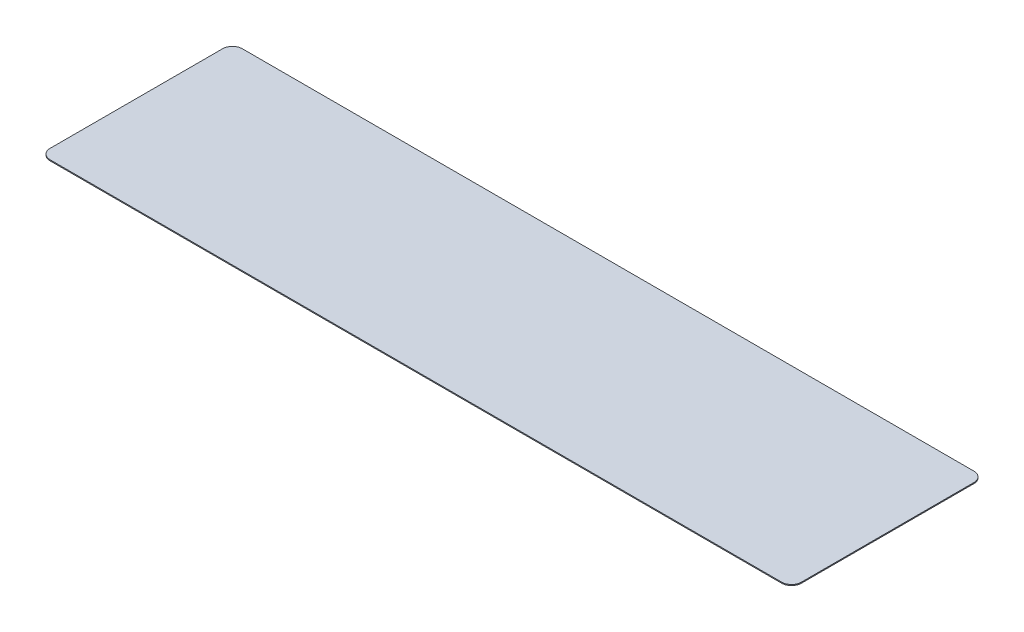
ISO-10303-21;
HEADER;
FILE_DESCRIPTION(('STEP AP214'),'2;1');
FILE_NAME('part.step','',(''),(''),'','','');
FILE_SCHEMA(('AUTOMOTIVE_DESIGN { 1 0 10303 214 1 1 1 1 }'));
ENDSEC;
DATA;
#1=APPLICATION_CONTEXT('core data for automotive mechanical design processes');
#2=APPLICATION_PROTOCOL_DEFINITION('international standard','automotive_design',2000,#1);
#3=PRODUCT_CONTEXT('',#1,'mechanical');
#4=PRODUCT('Part','Part','',(#3));
#5=PRODUCT_RELATED_PRODUCT_CATEGORY('part','',(#4));
#6=PRODUCT_DEFINITION_FORMATION('','',#4);
#7=PRODUCT_DEFINITION_CONTEXT('part definition',#1,'design');
#8=PRODUCT_DEFINITION('design','',#6,#7);
#9=PRODUCT_DEFINITION_SHAPE('','',#8);
#10=(LENGTH_UNIT() NAMED_UNIT(*) SI_UNIT(.MILLI.,.METRE.));
#11=(NAMED_UNIT(*) PLANE_ANGLE_UNIT() SI_UNIT($,.RADIAN.));
#12=(NAMED_UNIT(*) SI_UNIT($,.STERADIAN.) SOLID_ANGLE_UNIT());
#13=UNCERTAINTY_MEASURE_WITH_UNIT(LENGTH_MEASURE(1.E-05),#10,'distance_accuracy_value','');
#14=(GEOMETRIC_REPRESENTATION_CONTEXT(3) GLOBAL_UNCERTAINTY_ASSIGNED_CONTEXT((#13)) GLOBAL_UNIT_ASSIGNED_CONTEXT((#10,
#11,#12)) REPRESENTATION_CONTEXT('',''));
#15=CARTESIAN_POINT('',(0.,0.,0.));
#16=DIRECTION('',(0.,0.,1.));
#17=DIRECTION('',(1.,0.,0.));
#18=AXIS2_PLACEMENT_3D('',#15,#16,#17);
#19=CARTESIAN_POINT('',(74.2,0.2,17.5));
#20=DIRECTION('',(0.,-1.,0.));
#21=DIRECTION('',(0.,0.,-1.));
#22=AXIS2_PLACEMENT_3D('',#19,#20,#21);
#23=CYLINDRICAL_SURFACE('',#22,2.);
#24=CARTESIAN_POINT('',(74.2,0.,17.5));
#25=DIRECTION('',(0.,1.,0.));
#26=DIRECTION('',(0.,0.,1.));
#27=AXIS2_PLACEMENT_3D('',#24,#25,#26);
#28=CIRCLE('',#27,2.);
#29=CARTESIAN_POINT('',(74.2,0.,19.5));
#30=VERTEX_POINT('',#29);
#31=CARTESIAN_POINT('',(76.2,0.,17.5));
#32=VERTEX_POINT('',#31);
#33=EDGE_CURVE('E131',#30,#32,#28,.T.);
#34=ORIENTED_EDGE('',*,*,#33,.T.);
#35=DIRECTION('',(0.,-1.,0.));
#36=VECTOR('',#35,1.);
#37=CARTESIAN_POINT('',(76.2,0.2,17.5));
#38=LINE('',#37,#36);
#39=CARTESIAN_POINT('',(76.2,0.2,17.5));
#40=VERTEX_POINT('',#39);
#41=EDGE_CURVE('E11',#40,#32,#38,.T.);
#42=ORIENTED_EDGE('',*,*,#41,.F.);
#43=CARTESIAN_POINT('',(74.2,0.2,17.5));
#44=DIRECTION('',(0.,1.,0.));
#45=DIRECTION('',(0.,0.,1.));
#46=AXIS2_PLACEMENT_3D('',#43,#44,#45);
#47=CIRCLE('',#46,2.);
#48=CARTESIAN_POINT('',(74.2,0.2,19.5));
#49=VERTEX_POINT('',#48);
#50=EDGE_CURVE('E145',#49,#40,#47,.T.);
#51=ORIENTED_EDGE('',*,*,#50,.F.);
#52=DIRECTION('',(0.,-1.,0.));
#53=VECTOR('',#52,1.);
#54=CARTESIAN_POINT('',(74.2,0.2,19.5));
#55=LINE('',#54,#53);
#56=EDGE_CURVE('E127',#49,#30,#55,.T.);
#57=ORIENTED_EDGE('',*,*,#56,.T.);
#58=EDGE_LOOP('',(#34,#42,#51,#57));
#59=FACE_BOUND('',#58,.T.);
#60=ADVANCED_FACE('F35',(#59),#23,.T.);
#61=CARTESIAN_POINT('',(76.2,0.2,17.5));
#62=DIRECTION('',(-1.,0.,0.));
#63=DIRECTION('',(0.,0.,1.));
#64=AXIS2_PLACEMENT_3D('',#61,#62,#63);
#65=PLANE('',#64);
#66=DIRECTION('',(0.,0.,-1.));
#67=VECTOR('',#66,1.);
#68=CARTESIAN_POINT('',(76.2,0.,17.5));
#69=LINE('',#68,#67);
#70=CARTESIAN_POINT('',(76.2,0.,-17.5));
#71=VERTEX_POINT('',#70);
#72=EDGE_CURVE('E134',#32,#71,#69,.T.);
#73=ORIENTED_EDGE('',*,*,#72,.T.);
#74=DIRECTION('',(0.,-1.,0.));
#75=VECTOR('',#74,1.);
#76=CARTESIAN_POINT('',(76.2,0.2,-17.5));
#77=LINE('',#76,#75);
#78=CARTESIAN_POINT('',(76.2,0.2,-17.5));
#79=VERTEX_POINT('',#78);
#80=EDGE_CURVE('E43',#79,#71,#77,.T.);
#81=ORIENTED_EDGE('',*,*,#80,.F.);
#82=DIRECTION('',(0.,0.,-1.));
#83=VECTOR('',#82,1.);
#84=CARTESIAN_POINT('',(76.2,0.2,17.5));
#85=LINE('',#84,#83);
#86=EDGE_CURVE('E94',#40,#79,#85,.T.);
#87=ORIENTED_EDGE('',*,*,#86,.F.);
#88=ORIENTED_EDGE('',*,*,#41,.T.);
#89=EDGE_LOOP('',(#73,#81,#87,#88));
#90=FACE_BOUND('',#89,.T.);
#91=ADVANCED_FACE('F180',(#90),#65,.F.);
#92=CARTESIAN_POINT('',(74.2,0.2,-17.5));
#93=DIRECTION('',(0.,-1.,0.));
#94=DIRECTION('',(0.,0.,-1.));
#95=AXIS2_PLACEMENT_3D('',#92,#93,#94);
#96=CYLINDRICAL_SURFACE('',#95,2.);
#97=CARTESIAN_POINT('',(74.2,0.,-17.5));
#98=DIRECTION('',(0.,1.,0.));
#99=DIRECTION('',(0.,0.,1.));
#100=AXIS2_PLACEMENT_3D('',#97,#98,#99);
#101=CIRCLE('',#100,2.);
#102=CARTESIAN_POINT('',(74.2,0.,-19.5));
#103=VERTEX_POINT('',#102);
#104=EDGE_CURVE('E136',#71,#103,#101,.T.);
#105=ORIENTED_EDGE('',*,*,#104,.T.);
#106=DIRECTION('',(0.,-1.,0.));
#107=VECTOR('',#106,1.);
#108=CARTESIAN_POINT('',(74.2,0.2,-19.5));
#109=LINE('',#108,#107);
#110=CARTESIAN_POINT('',(74.2,0.2,-19.5));
#111=VERTEX_POINT('',#110);
#112=EDGE_CURVE('E152',#111,#103,#109,.T.);
#113=ORIENTED_EDGE('',*,*,#112,.F.);
#114=CARTESIAN_POINT('',(74.2,0.2,-17.5));
#115=DIRECTION('',(0.,1.,0.));
#116=DIRECTION('',(0.,0.,1.));
#117=AXIS2_PLACEMENT_3D('',#114,#115,#116);
#118=CIRCLE('',#117,2.);
#119=EDGE_CURVE('E160',#79,#111,#118,.T.);
#120=ORIENTED_EDGE('',*,*,#119,.F.);
#121=ORIENTED_EDGE('',*,*,#80,.T.);
#122=EDGE_LOOP('',(#105,#113,#120,#121));
#123=FACE_BOUND('',#122,.T.);
#124=ADVANCED_FACE('F158',(#123),#96,.T.);
#125=CARTESIAN_POINT('',(74.2,0.2,-19.5));
#126=DIRECTION('',(0.,0.,1.));
#127=DIRECTION('',(1.,0.,0.));
#128=AXIS2_PLACEMENT_3D('',#125,#126,#127);
#129=PLANE('',#128);
#130=DIRECTION('',(-1.,0.,0.));
#131=VECTOR('',#130,1.);
#132=CARTESIAN_POINT('',(74.2,0.,-19.5));
#133=LINE('',#132,#131);
#134=CARTESIAN_POINT('',(-74.2,0.,-19.5));
#135=VERTEX_POINT('',#134);
#136=EDGE_CURVE('E138',#103,#135,#133,.T.);
#137=ORIENTED_EDGE('',*,*,#136,.T.);
#138=DIRECTION('',(0.,-1.,0.));
#139=VECTOR('',#138,1.);
#140=CARTESIAN_POINT('',(-74.2,0.2,-19.5));
#141=LINE('',#140,#139);
#142=CARTESIAN_POINT('',(-74.2,0.2,-19.5));
#143=VERTEX_POINT('',#142);
#144=EDGE_CURVE('E149',#143,#135,#141,.T.);
#145=ORIENTED_EDGE('',*,*,#144,.F.);
#146=DIRECTION('',(-1.,0.,0.));
#147=VECTOR('',#146,1.);
#148=CARTESIAN_POINT('',(74.2,0.2,-19.5));
#149=LINE('',#148,#147);
#150=EDGE_CURVE('E172',#111,#143,#149,.T.);
#151=ORIENTED_EDGE('',*,*,#150,.F.);
#152=ORIENTED_EDGE('',*,*,#112,.T.);
#153=EDGE_LOOP('',(#137,#145,#151,#152));
#154=FACE_BOUND('',#153,.T.);
#155=ADVANCED_FACE('F168',(#154),#129,.F.);
#156=CARTESIAN_POINT('',(-74.2,0.2,-17.5));
#157=DIRECTION('',(0.,-1.,0.));
#158=DIRECTION('',(0.,0.,-1.));
#159=AXIS2_PLACEMENT_3D('',#156,#157,#158);
#160=CYLINDRICAL_SURFACE('',#159,2.);
#161=CARTESIAN_POINT('',(-74.2,0.,-17.5));
#162=DIRECTION('',(0.,1.,0.));
#163=DIRECTION('',(0.,0.,1.));
#164=AXIS2_PLACEMENT_3D('',#161,#162,#163);
#165=CIRCLE('',#164,2.);
#166=CARTESIAN_POINT('',(-76.2,0.,-17.5));
#167=VERTEX_POINT('',#166);
#168=EDGE_CURVE('E140',#135,#167,#165,.T.);
#169=ORIENTED_EDGE('',*,*,#168,.T.);
#170=DIRECTION('',(0.,-1.,0.));
#171=VECTOR('',#170,1.);
#172=CARTESIAN_POINT('',(-76.2,0.2,-17.5));
#173=LINE('',#172,#171);
#174=CARTESIAN_POINT('',(-76.2,0.2,-17.5));
#175=VERTEX_POINT('',#174);
#176=EDGE_CURVE('E122',#175,#167,#173,.T.);
#177=ORIENTED_EDGE('',*,*,#176,.F.);
#178=CARTESIAN_POINT('',(-74.2,0.2,-17.5));
#179=DIRECTION('',(0.,1.,0.));
#180=DIRECTION('',(0.,0.,1.));
#181=AXIS2_PLACEMENT_3D('',#178,#179,#180);
#182=CIRCLE('',#181,2.);
#183=EDGE_CURVE('E113',#143,#175,#182,.T.);
#184=ORIENTED_EDGE('',*,*,#183,.F.);
#185=ORIENTED_EDGE('',*,*,#144,.T.);
#186=EDGE_LOOP('',(#169,#177,#184,#185));
#187=FACE_BOUND('',#186,.T.);
#188=ADVANCED_FACE('F171',(#187),#160,.T.);
#189=CARTESIAN_POINT('',(-76.2,0.2,17.5));
#190=DIRECTION('',(1.,0.,0.));
#191=DIRECTION('',(0.,0.,-1.));
#192=AXIS2_PLACEMENT_3D('',#189,#190,#191);
#193=PLANE('',#192);
#194=DIRECTION('',(0.,0.,1.));
#195=VECTOR('',#194,1.);
#196=CARTESIAN_POINT('',(-76.2,0.,17.5));
#197=LINE('',#196,#195);
#198=CARTESIAN_POINT('',(-76.2,0.,17.5));
#199=VERTEX_POINT('',#198);
#200=EDGE_CURVE('E121',#167,#199,#197,.T.);
#201=ORIENTED_EDGE('',*,*,#200,.T.);
#202=DIRECTION('',(0.,-1.,0.));
#203=VECTOR('',#202,1.);
#204=CARTESIAN_POINT('',(-76.2,0.2,17.5));
#205=LINE('',#204,#203);
#206=CARTESIAN_POINT('',(-76.2,0.2,17.5));
#207=VERTEX_POINT('',#206);
#208=EDGE_CURVE('E118',#207,#199,#205,.T.);
#209=ORIENTED_EDGE('',*,*,#208,.F.);
#210=DIRECTION('',(0.,0.,1.));
#211=VECTOR('',#210,1.);
#212=CARTESIAN_POINT('',(-76.2,0.2,17.5));
#213=LINE('',#212,#211);
#214=EDGE_CURVE('E107',#175,#207,#213,.T.);
#215=ORIENTED_EDGE('',*,*,#214,.F.);
#216=ORIENTED_EDGE('',*,*,#176,.T.);
#217=EDGE_LOOP('',(#201,#209,#215,#216));
#218=FACE_BOUND('',#217,.T.);
#219=ADVANCED_FACE('F119',(#218),#193,.F.);
#220=CARTESIAN_POINT('',(-74.2,0.2,17.5));
#221=DIRECTION('',(0.,-1.,0.));
#222=DIRECTION('',(0.,0.,-1.));
#223=AXIS2_PLACEMENT_3D('',#220,#221,#222);
#224=CYLINDRICAL_SURFACE('',#223,2.);
#225=CARTESIAN_POINT('',(-74.2,0.,17.5));
#226=DIRECTION('',(0.,1.,0.));
#227=DIRECTION('',(0.,0.,-1.));
#228=AXIS2_PLACEMENT_3D('',#225,#226,#227);
#229=CIRCLE('',#228,2.);
#230=CARTESIAN_POINT('',(-74.2,0.,19.5));
#231=VERTEX_POINT('',#230);
#232=EDGE_CURVE('E80',#199,#231,#229,.T.);
#233=ORIENTED_EDGE('',*,*,#232,.T.);
#234=DIRECTION('',(0.,-1.,0.));
#235=VECTOR('',#234,1.);
#236=CARTESIAN_POINT('',(-74.2,0.2,19.5));
#237=LINE('',#236,#235);
#238=CARTESIAN_POINT('',(-74.2,0.2,19.5));
#239=VERTEX_POINT('',#238);
#240=EDGE_CURVE('E123',#239,#231,#237,.T.);
#241=ORIENTED_EDGE('',*,*,#240,.F.);
#242=CARTESIAN_POINT('',(-74.2,0.2,17.5));
#243=DIRECTION('',(0.,1.,0.));
#244=DIRECTION('',(0.,0.,-1.));
#245=AXIS2_PLACEMENT_3D('',#242,#243,#244);
#246=CIRCLE('',#245,2.);
#247=EDGE_CURVE('E111',#207,#239,#246,.T.);
#248=ORIENTED_EDGE('',*,*,#247,.F.);
#249=ORIENTED_EDGE('',*,*,#208,.T.);
#250=EDGE_LOOP('',(#233,#241,#248,#249));
#251=FACE_BOUND('',#250,.T.);
#252=ADVANCED_FACE('F125',(#251),#224,.T.);
#253=CARTESIAN_POINT('',(74.2,0.2,19.5));
#254=DIRECTION('',(0.,0.,-1.));
#255=DIRECTION('',(-1.,0.,0.));
#256=AXIS2_PLACEMENT_3D('',#253,#254,#255);
#257=PLANE('',#256);
#258=DIRECTION('',(1.,0.,0.));
#259=VECTOR('',#258,1.);
#260=CARTESIAN_POINT('',(74.2,0.,19.5));
#261=LINE('',#260,#259);
#262=EDGE_CURVE('E86',#231,#30,#261,.T.);
#263=ORIENTED_EDGE('',*,*,#262,.T.);
#264=ORIENTED_EDGE('',*,*,#56,.F.);
#265=DIRECTION('',(1.,0.,0.));
#266=VECTOR('',#265,1.);
#267=CARTESIAN_POINT('',(74.2,0.2,19.5));
#268=LINE('',#267,#266);
#269=EDGE_CURVE('E51',#239,#49,#268,.T.);
#270=ORIENTED_EDGE('',*,*,#269,.F.);
#271=ORIENTED_EDGE('',*,*,#240,.T.);
#272=EDGE_LOOP('',(#263,#264,#270,#271));
#273=FACE_BOUND('',#272,.T.);
#274=ADVANCED_FACE('F196',(#273),#257,.F.);
#275=CARTESIAN_POINT('',(74.2,0.2,17.5));
#276=DIRECTION('',(0.,1.,0.));
#277=DIRECTION('',(0.,0.,1.));
#278=AXIS2_PLACEMENT_3D('',#275,#276,#277);
#279=PLANE('',#278);
#280=ORIENTED_EDGE('',*,*,#50,.T.);
#281=ORIENTED_EDGE('',*,*,#86,.T.);
#282=ORIENTED_EDGE('',*,*,#119,.T.);
#283=ORIENTED_EDGE('',*,*,#150,.T.);
#284=ORIENTED_EDGE('',*,*,#183,.T.);
#285=ORIENTED_EDGE('',*,*,#214,.T.);
#286=ORIENTED_EDGE('',*,*,#247,.T.);
#287=ORIENTED_EDGE('',*,*,#269,.T.);
#288=EDGE_LOOP('',(#280,#281,#282,#283,#284,#285,#286,#287));
#289=FACE_BOUND('',#288,.T.);
#290=ADVANCED_FACE('F109',(#289),#279,.T.);
#291=CARTESIAN_POINT('',(74.2,0.,17.5));
#292=DIRECTION('',(0.,1.,0.));
#293=DIRECTION('',(0.,0.,1.));
#294=AXIS2_PLACEMENT_3D('',#291,#292,#293);
#295=PLANE('',#294);
#296=ORIENTED_EDGE('',*,*,#33,.F.);
#297=ORIENTED_EDGE('',*,*,#262,.F.);
#298=ORIENTED_EDGE('',*,*,#232,.F.);
#299=ORIENTED_EDGE('',*,*,#200,.F.);
#300=ORIENTED_EDGE('',*,*,#168,.F.);
#301=ORIENTED_EDGE('',*,*,#136,.F.);
#302=ORIENTED_EDGE('',*,*,#104,.F.);
#303=ORIENTED_EDGE('',*,*,#72,.F.);
#304=EDGE_LOOP('',(#296,#297,#298,#299,#300,#301,#302,#303));
#305=FACE_BOUND('',#304,.T.);
#306=ADVANCED_FACE('F164',(#305),#295,.F.);
#307=CLOSED_SHELL('',(#60,#91,#124,#155,#188,#219,#252,#274,#290,#306));
#308=MANIFOLD_SOLID_BREP('B2',#307);
#309=ADVANCED_BREP_SHAPE_REPRESENTATION('',(#18,#308),#14);
#310=SHAPE_DEFINITION_REPRESENTATION(#9,#309);
ENDSEC;
END-ISO-10303-21;
